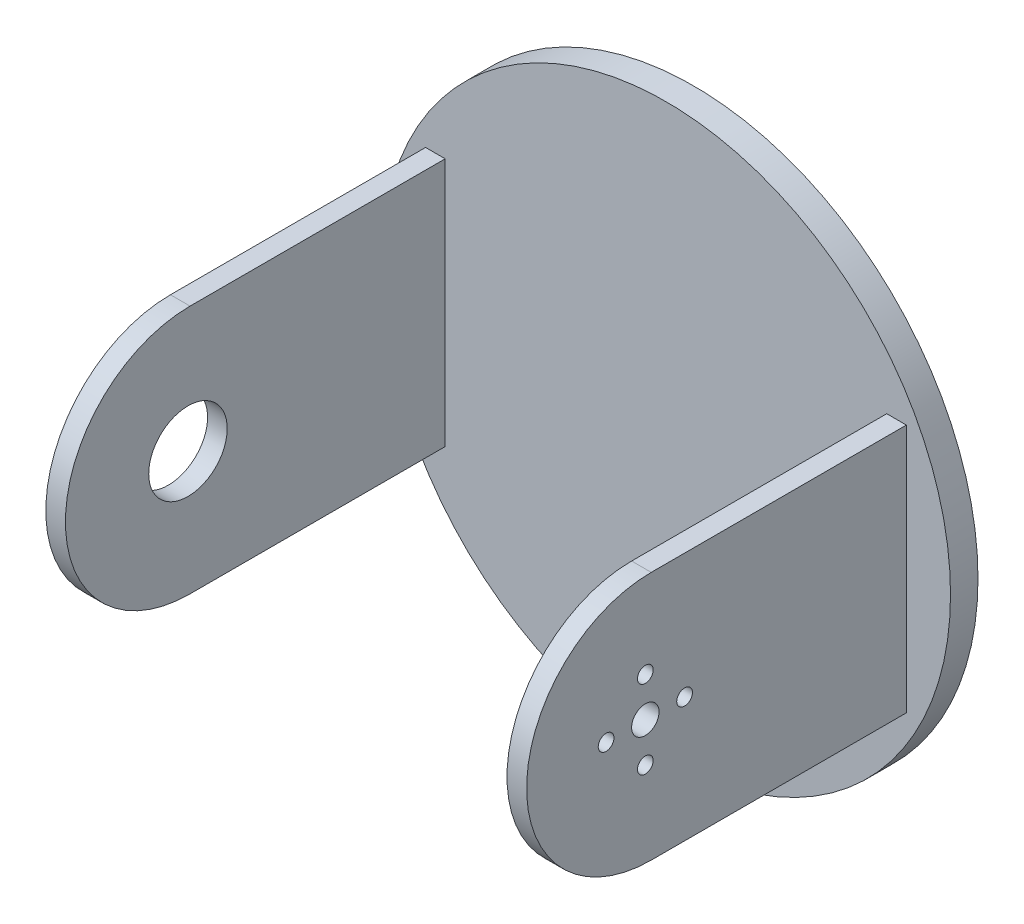
ISO-10303-21;
HEADER;
FILE_DESCRIPTION(('STEP AP214'),'2;1');
FILE_NAME('part.step','',(''),(''),'','','');
FILE_SCHEMA(('AUTOMOTIVE_DESIGN { 1 0 10303 214 1 1 1 1 }'));
ENDSEC;
DATA;
#1=APPLICATION_CONTEXT('core data for automotive mechanical design processes');
#2=APPLICATION_PROTOCOL_DEFINITION('international standard','automotive_design',2000,#1);
#3=PRODUCT_CONTEXT('',#1,'mechanical');
#4=PRODUCT('Part','Part','',(#3));
#5=PRODUCT_RELATED_PRODUCT_CATEGORY('part','',(#4));
#6=PRODUCT_DEFINITION_FORMATION('','',#4);
#7=PRODUCT_DEFINITION_CONTEXT('part definition',#1,'design');
#8=PRODUCT_DEFINITION('design','',#6,#7);
#9=PRODUCT_DEFINITION_SHAPE('','',#8);
#10=(LENGTH_UNIT() NAMED_UNIT(*) SI_UNIT(.MILLI.,.METRE.));
#11=(NAMED_UNIT(*) PLANE_ANGLE_UNIT() SI_UNIT($,.RADIAN.));
#12=(NAMED_UNIT(*) SI_UNIT($,.STERADIAN.) SOLID_ANGLE_UNIT());
#13=UNCERTAINTY_MEASURE_WITH_UNIT(LENGTH_MEASURE(1.E-05),#10,'distance_accuracy_value','');
#14=(GEOMETRIC_REPRESENTATION_CONTEXT(3) GLOBAL_UNCERTAINTY_ASSIGNED_CONTEXT((#13)) GLOBAL_UNIT_ASSIGNED_CONTEXT((#10,
#11,#12)) REPRESENTATION_CONTEXT('',''));
#15=CARTESIAN_POINT('',(0.,0.,0.));
#16=DIRECTION('',(0.,0.,1.));
#17=DIRECTION('',(1.,0.,0.));
#18=AXIS2_PLACEMENT_3D('',#15,#16,#17);
#19=CARTESIAN_POINT('',(0.,0.,0.));
#20=DIRECTION('',(0.,0.,1.));
#21=DIRECTION('',(1.,0.,0.));
#22=AXIS2_PLACEMENT_3D('',#19,#20,#21);
#23=PLANE('',#22);
#24=CARTESIAN_POINT('',(0.,0.,0.));
#25=DIRECTION('',(0.,0.,1.));
#26=DIRECTION('',(1.,0.,0.));
#27=AXIS2_PLACEMENT_3D('',#24,#25,#26);
#28=CIRCLE('',#27,72.5);
#29=CARTESIAN_POINT('',(72.5,0.,0.));
#30=VERTEX_POINT('',#29);
#31=EDGE_CURVE('E208',#30,#30,#28,.T.);
#32=ORIENTED_EDGE('',*,*,#31,.T.);
#33=EDGE_LOOP('',(#32));
#34=FACE_BOUND('',#33,.T.);
#35=DIRECTION('',(-1.,0.,0.));
#36=VECTOR('',#35,1.);
#37=CARTESIAN_POINT('',(-56.25,31.75,0.));
#38=LINE('',#37,#36);
#39=CARTESIAN_POINT('',(-56.25,31.75,0.));
#40=VERTEX_POINT('',#39);
#41=CARTESIAN_POINT('',(-61.25,31.75,0.));
#42=VERTEX_POINT('',#41);
#43=EDGE_CURVE('E143',#40,#42,#38,.T.);
#44=ORIENTED_EDGE('',*,*,#43,.F.);
#45=DIRECTION('',(0.,-1.,0.));
#46=VECTOR('',#45,1.);
#47=CARTESIAN_POINT('',(-56.25,31.75,0.));
#48=LINE('',#47,#46);
#49=CARTESIAN_POINT('',(-56.25,-31.75,0.));
#50=VERTEX_POINT('',#49);
#51=EDGE_CURVE('E139',#40,#50,#48,.T.);
#52=ORIENTED_EDGE('',*,*,#51,.T.);
#53=DIRECTION('',(1.,0.,0.));
#54=VECTOR('',#53,1.);
#55=CARTESIAN_POINT('',(-61.25,-31.75,0.));
#56=LINE('',#55,#54);
#57=CARTESIAN_POINT('',(-61.25,-31.75,0.));
#58=VERTEX_POINT('',#57);
#59=EDGE_CURVE('E150',#58,#50,#56,.T.);
#60=ORIENTED_EDGE('',*,*,#59,.F.);
#61=DIRECTION('',(0.,-1.,0.));
#62=VECTOR('',#61,1.);
#63=CARTESIAN_POINT('',(-61.25,31.75,0.));
#64=LINE('',#63,#62);
#65=EDGE_CURVE('E125',#42,#58,#64,.T.);
#66=ORIENTED_EDGE('',*,*,#65,.F.);
#67=EDGE_LOOP('',(#44,#52,#60,#66));
#68=FACE_BOUND('',#67,.T.);
#69=DIRECTION('',(-1.,0.,0.));
#70=VECTOR('',#69,1.);
#71=CARTESIAN_POINT('',(61.25,-31.75,0.));
#72=LINE('',#71,#70);
#73=CARTESIAN_POINT('',(61.25,-31.75,0.));
#74=VERTEX_POINT('',#73);
#75=CARTESIAN_POINT('',(56.25,-31.75,0.));
#76=VERTEX_POINT('',#75);
#77=EDGE_CURVE('E57',#74,#76,#72,.T.);
#78=ORIENTED_EDGE('',*,*,#77,.T.);
#79=DIRECTION('',(0.,-1.,0.));
#80=VECTOR('',#79,1.);
#81=CARTESIAN_POINT('',(56.25,31.75,0.));
#82=LINE('',#81,#80);
#83=CARTESIAN_POINT('',(56.25,31.75,0.));
#84=VERTEX_POINT('',#83);
#85=EDGE_CURVE('E204',#84,#76,#82,.T.);
#86=ORIENTED_EDGE('',*,*,#85,.F.);
#87=DIRECTION('',(1.,0.,0.));
#88=VECTOR('',#87,1.);
#89=CARTESIAN_POINT('',(56.25,31.75,0.));
#90=LINE('',#89,#88);
#91=CARTESIAN_POINT('',(61.25,31.75,0.));
#92=VERTEX_POINT('',#91);
#93=EDGE_CURVE('E196',#84,#92,#90,.T.);
#94=ORIENTED_EDGE('',*,*,#93,.T.);
#95=DIRECTION('',(0.,-1.,0.));
#96=VECTOR('',#95,1.);
#97=CARTESIAN_POINT('',(61.25,31.75,0.));
#98=LINE('',#97,#96);
#99=EDGE_CURVE('E62',#92,#74,#98,.T.);
#100=ORIENTED_EDGE('',*,*,#99,.T.);
#101=EDGE_LOOP('',(#78,#86,#94,#100));
#102=FACE_BOUND('',#101,.T.);
#103=ADVANCED_FACE('F39',(#34,#68,#102),#23,.T.);
#104=CARTESIAN_POINT('',(-56.25,31.75,65.));
#105=DIRECTION('',(0.,-1.,0.));
#106=DIRECTION('',(0.,0.,-1.));
#107=AXIS2_PLACEMENT_3D('',#104,#105,#106);
#108=PLANE('',#107);
#109=ORIENTED_EDGE('',*,*,#43,.T.);
#110=DIRECTION('',(0.,0.,-1.));
#111=VECTOR('',#110,1.);
#112=CARTESIAN_POINT('',(-61.25,31.75,65.));
#113=LINE('',#112,#111);
#114=CARTESIAN_POINT('',(-61.25,31.75,65.));
#115=VERTEX_POINT('',#114);
#116=EDGE_CURVE('E43',#115,#42,#113,.T.);
#117=ORIENTED_EDGE('',*,*,#116,.F.);
#118=DIRECTION('',(-1.,0.,0.));
#119=VECTOR('',#118,1.);
#120=CARTESIAN_POINT('',(-56.25,31.75,65.));
#121=LINE('',#120,#119);
#122=CARTESIAN_POINT('',(-56.25,31.75,65.));
#123=VERTEX_POINT('',#122);
#124=EDGE_CURVE('E113',#123,#115,#121,.T.);
#125=ORIENTED_EDGE('',*,*,#124,.F.);
#126=DIRECTION('',(0.,0.,-1.));
#127=VECTOR('',#126,1.);
#128=CARTESIAN_POINT('',(-56.25,31.75,65.));
#129=LINE('',#128,#127);
#130=EDGE_CURVE('E133',#123,#40,#129,.T.);
#131=ORIENTED_EDGE('',*,*,#130,.T.);
#132=EDGE_LOOP('',(#109,#117,#125,#131));
#133=FACE_BOUND('',#132,.T.);
#134=ADVANCED_FACE('F41',(#133),#108,.F.);
#135=CARTESIAN_POINT('',(-61.25,31.75,65.));
#136=DIRECTION('',(1.,0.,0.));
#137=DIRECTION('',(0.,0.,-1.));
#138=AXIS2_PLACEMENT_3D('',#135,#136,#137);
#139=PLANE('',#138);
#140=CARTESIAN_POINT('',(-61.25,0.,65.5309086036091));
#141=DIRECTION('',(-1.,0.,0.));
#142=DIRECTION('',(0.,0.,1.));
#143=AXIS2_PLACEMENT_3D('',#140,#141,#142);
#144=CIRCLE('',#143,10.);
#145=CARTESIAN_POINT('',(-61.25,0.,75.5309086036091));
#146=VERTEX_POINT('',#145);
#147=EDGE_CURVE('E314',#146,#146,#144,.T.);
#148=ORIENTED_EDGE('',*,*,#147,.F.);
#149=EDGE_LOOP('',(#148));
#150=FACE_BOUND('',#149,.T.);
#151=ORIENTED_EDGE('',*,*,#65,.T.);
#152=DIRECTION('',(0.,0.,-1.));
#153=VECTOR('',#152,1.);
#154=CARTESIAN_POINT('',(-61.25,-31.75,65.));
#155=LINE('',#154,#153);
#156=CARTESIAN_POINT('',(-61.25,-31.75,65.));
#157=VERTEX_POINT('',#156);
#158=EDGE_CURVE('E123',#157,#58,#155,.T.);
#159=ORIENTED_EDGE('',*,*,#158,.F.);
#160=CARTESIAN_POINT('',(-61.25,0.,65.));
#161=DIRECTION('',(1.,0.,0.));
#162=DIRECTION('',(0.,1.,0.));
#163=AXIS2_PLACEMENT_3D('',#160,#161,#162);
#164=CIRCLE('',#163,31.75);
#165=EDGE_CURVE('E106',#115,#157,#164,.T.);
#166=ORIENTED_EDGE('',*,*,#165,.F.);
#167=ORIENTED_EDGE('',*,*,#116,.T.);
#168=EDGE_LOOP('',(#151,#159,#166,#167));
#169=FACE_BOUND('',#168,.T.);
#170=ADVANCED_FACE('F124',(#150,#169),#139,.F.);
#171=CARTESIAN_POINT('',(-61.25,-31.75,65.));
#172=DIRECTION('',(0.,1.,0.));
#173=DIRECTION('',(0.,0.,1.));
#174=AXIS2_PLACEMENT_3D('',#171,#172,#173);
#175=PLANE('',#174);
#176=ORIENTED_EDGE('',*,*,#59,.T.);
#177=DIRECTION('',(0.,0.,-1.));
#178=VECTOR('',#177,1.);
#179=CARTESIAN_POINT('',(-56.25,-31.75,65.));
#180=LINE('',#179,#178);
#181=CARTESIAN_POINT('',(-56.25,-31.75,65.));
#182=VERTEX_POINT('',#181);
#183=EDGE_CURVE('E129',#182,#50,#180,.T.);
#184=ORIENTED_EDGE('',*,*,#183,.F.);
#185=DIRECTION('',(1.,0.,0.));
#186=VECTOR('',#185,1.);
#187=CARTESIAN_POINT('',(-61.25,-31.75,65.));
#188=LINE('',#187,#186);
#189=EDGE_CURVE('E110',#157,#182,#188,.T.);
#190=ORIENTED_EDGE('',*,*,#189,.F.);
#191=ORIENTED_EDGE('',*,*,#158,.T.);
#192=EDGE_LOOP('',(#176,#184,#190,#191));
#193=FACE_BOUND('',#192,.T.);
#194=ADVANCED_FACE('F130',(#193),#175,.F.);
#195=CARTESIAN_POINT('',(-56.25,31.75,65.));
#196=DIRECTION('',(1.,0.,0.));
#197=DIRECTION('',(0.,1.,0.));
#198=AXIS2_PLACEMENT_3D('',#195,#196,#197);
#199=PLANE('',#198);
#200=CARTESIAN_POINT('',(-56.25,0.,65.5309086036091));
#201=DIRECTION('',(1.,0.,0.));
#202=DIRECTION('',(0.,1.,0.));
#203=AXIS2_PLACEMENT_3D('',#200,#201,#202);
#204=CIRCLE('',#203,10.);
#205=CARTESIAN_POINT('',(-56.25,10.,65.5309086036091));
#206=VERTEX_POINT('',#205);
#207=EDGE_CURVE('E317',#206,#206,#204,.F.);
#208=ORIENTED_EDGE('',*,*,#207,.T.);
#209=EDGE_LOOP('',(#208));
#210=FACE_BOUND('',#209,.T.);
#211=ORIENTED_EDGE('',*,*,#51,.F.);
#212=ORIENTED_EDGE('',*,*,#130,.F.);
#213=CARTESIAN_POINT('',(-56.25,0.,65.));
#214=DIRECTION('',(1.,0.,0.));
#215=DIRECTION('',(0.,1.,0.));
#216=AXIS2_PLACEMENT_3D('',#213,#214,#215);
#217=CIRCLE('',#216,31.75);
#218=EDGE_CURVE('E119',#123,#182,#217,.T.);
#219=ORIENTED_EDGE('',*,*,#218,.T.);
#220=ORIENTED_EDGE('',*,*,#183,.T.);
#221=EDGE_LOOP('',(#211,#212,#219,#220));
#222=FACE_BOUND('',#221,.T.);
#223=ADVANCED_FACE('F158',(#210,#222),#199,.T.);
#224=CARTESIAN_POINT('',(0.,0.,-7.));
#225=DIRECTION('',(0.,0.,1.));
#226=DIRECTION('',(1.,0.,0.));
#227=AXIS2_PLACEMENT_3D('',#224,#225,#226);
#228=CYLINDRICAL_SURFACE('',#227,72.5);
#229=CARTESIAN_POINT('',(0.,0.,-7.));
#230=DIRECTION('',(0.,0.,1.));
#231=DIRECTION('',(1.,0.,0.));
#232=AXIS2_PLACEMENT_3D('',#229,#230,#231);
#233=CIRCLE('',#232,72.5);
#234=CARTESIAN_POINT('',(72.5,0.,-7.));
#235=VERTEX_POINT('',#234);
#236=EDGE_CURVE('E147',#235,#235,#233,.T.);
#237=ORIENTED_EDGE('',*,*,#236,.T.);
#238=EDGE_LOOP('',(#237));
#239=FACE_BOUND('',#238,.T.);
#240=ORIENTED_EDGE('',*,*,#31,.F.);
#241=EDGE_LOOP('',(#240));
#242=FACE_BOUND('',#241,.T.);
#243=ADVANCED_FACE('F221',(#239,#242),#228,.T.);
#244=CARTESIAN_POINT('',(0.,0.,-7.));
#245=DIRECTION('',(0.,0.,1.));
#246=DIRECTION('',(1.,0.,0.));
#247=AXIS2_PLACEMENT_3D('',#244,#245,#246);
#248=PLANE('',#247);
#249=CARTESIAN_POINT('',(0.,0.,-7.));
#250=DIRECTION('',(0.,0.,-1.));
#251=DIRECTION('',(-1.,0.,0.));
#252=AXIS2_PLACEMENT_3D('',#249,#250,#251);
#253=CIRCLE('',#252,30.);
#254=CARTESIAN_POINT('',(-30.,0.,-7.));
#255=VERTEX_POINT('',#254);
#256=EDGE_CURVE('E49',#255,#255,#253,.T.);
#257=ORIENTED_EDGE('',*,*,#256,.F.);
#258=EDGE_LOOP('',(#257));
#259=FACE_BOUND('',#258,.T.);
#260=ORIENTED_EDGE('',*,*,#236,.F.);
#261=EDGE_LOOP('',(#260));
#262=FACE_BOUND('',#261,.T.);
#263=ADVANCED_FACE('F223',(#259,#262),#248,.F.);
#264=CARTESIAN_POINT('',(56.25,31.75,65.));
#265=DIRECTION('',(1.,0.,0.));
#266=DIRECTION('',(0.,0.,-1.));
#267=AXIS2_PLACEMENT_3D('',#264,#265,#266);
#268=PLANE('',#267);
#269=CARTESIAN_POINT('',(56.25,10.,66.5059939664445));
#270=DIRECTION('',(1.,0.,0.));
#271=DIRECTION('',(0.,0.,-1.));
#272=AXIS2_PLACEMENT_3D('',#269,#270,#271);
#273=CIRCLE('',#272,2.);
#274=CARTESIAN_POINT('',(56.25,10.,64.5059939664445));
#275=VERTEX_POINT('',#274);
#276=EDGE_CURVE('E332',#275,#275,#273,.F.);
#277=ORIENTED_EDGE('',*,*,#276,.F.);
#278=EDGE_LOOP('',(#277));
#279=FACE_BOUND('',#278,.T.);
#280=CARTESIAN_POINT('',(56.25,0.,76.5059939664445));
#281=DIRECTION('',(1.,0.,0.));
#282=DIRECTION('',(0.,0.,-1.));
#283=AXIS2_PLACEMENT_3D('',#280,#281,#282);
#284=CIRCLE('',#283,2.00000000000001);
#285=CARTESIAN_POINT('',(56.25,0.,74.5059939664445));
#286=VERTEX_POINT('',#285);
#287=EDGE_CURVE('E319',#286,#286,#284,.F.);
#288=ORIENTED_EDGE('',*,*,#287,.F.);
#289=EDGE_LOOP('',(#288));
#290=FACE_BOUND('',#289,.T.);
#291=CARTESIAN_POINT('',(56.25,-10.,66.5059939664445));
#292=DIRECTION('',(1.,0.,0.));
#293=DIRECTION('',(0.,0.,-1.));
#294=AXIS2_PLACEMENT_3D('',#291,#292,#293);
#295=CIRCLE('',#294,2.);
#296=CARTESIAN_POINT('',(56.25,-10.,64.5059939664445));
#297=VERTEX_POINT('',#296);
#298=EDGE_CURVE('E338',#297,#297,#295,.F.);
#299=ORIENTED_EDGE('',*,*,#298,.F.);
#300=EDGE_LOOP('',(#299));
#301=FACE_BOUND('',#300,.T.);
#302=CARTESIAN_POINT('',(56.25,0.,66.5059939664445));
#303=DIRECTION('',(1.,0.,0.));
#304=DIRECTION('',(0.,0.,-1.));
#305=AXIS2_PLACEMENT_3D('',#302,#303,#304);
#306=CIRCLE('',#305,3.49999999999999);
#307=CARTESIAN_POINT('',(56.25,0.,63.0059939664445));
#308=VERTEX_POINT('',#307);
#309=EDGE_CURVE('E345',#308,#308,#306,.F.);
#310=ORIENTED_EDGE('',*,*,#309,.F.);
#311=EDGE_LOOP('',(#310));
#312=FACE_BOUND('',#311,.T.);
#313=CARTESIAN_POINT('',(56.25,0.,56.5059939664445));
#314=DIRECTION('',(1.,0.,0.));
#315=DIRECTION('',(0.,0.,-1.));
#316=AXIS2_PLACEMENT_3D('',#313,#314,#315);
#317=CIRCLE('',#316,2.);
#318=CARTESIAN_POINT('',(56.25,0.,54.5059939664445));
#319=VERTEX_POINT('',#318);
#320=EDGE_CURVE('E350',#319,#319,#317,.F.);
#321=ORIENTED_EDGE('',*,*,#320,.F.);
#322=EDGE_LOOP('',(#321));
#323=FACE_BOUND('',#322,.T.);
#324=ORIENTED_EDGE('',*,*,#85,.T.);
#325=DIRECTION('',(0.,0.,-1.));
#326=VECTOR('',#325,1.);
#327=CARTESIAN_POINT('',(56.25,-31.75,65.));
#328=LINE('',#327,#326);
#329=CARTESIAN_POINT('',(56.25,-31.75,65.));
#330=VERTEX_POINT('',#329);
#331=EDGE_CURVE('E178',#330,#76,#328,.T.);
#332=ORIENTED_EDGE('',*,*,#331,.F.);
#333=CARTESIAN_POINT('',(56.25,0.,65.));
#334=DIRECTION('',(-1.,0.,0.));
#335=DIRECTION('',(0.,0.,1.));
#336=AXIS2_PLACEMENT_3D('',#333,#334,#335);
#337=CIRCLE('',#336,31.75);
#338=CARTESIAN_POINT('',(56.25,31.75,65.));
#339=VERTEX_POINT('',#338);
#340=EDGE_CURVE('E118',#330,#339,#337,.T.);
#341=ORIENTED_EDGE('',*,*,#340,.T.);
#342=DIRECTION('',(0.,0.,-1.));
#343=VECTOR('',#342,1.);
#344=CARTESIAN_POINT('',(56.25,31.75,65.));
#345=LINE('',#344,#343);
#346=EDGE_CURVE('E191',#339,#84,#345,.T.);
#347=ORIENTED_EDGE('',*,*,#346,.T.);
#348=EDGE_LOOP('',(#324,#332,#341,#347));
#349=FACE_BOUND('',#348,.T.);
#350=ADVANCED_FACE('F230',(#279,#290,#301,#312,#323,#349),#268,.F.);
#351=CARTESIAN_POINT('',(61.25,-31.75,65.));
#352=DIRECTION('',(0.,-1.,0.));
#353=DIRECTION('',(0.,0.,-1.));
#354=AXIS2_PLACEMENT_3D('',#351,#352,#353);
#355=PLANE('',#354);
#356=ORIENTED_EDGE('',*,*,#77,.F.);
#357=DIRECTION('',(0.,0.,-1.));
#358=VECTOR('',#357,1.);
#359=CARTESIAN_POINT('',(61.25,-31.75,65.));
#360=LINE('',#359,#358);
#361=CARTESIAN_POINT('',(61.25,-31.75,65.));
#362=VERTEX_POINT('',#361);
#363=EDGE_CURVE('E184',#362,#74,#360,.T.);
#364=ORIENTED_EDGE('',*,*,#363,.F.);
#365=DIRECTION('',(-1.,0.,0.));
#366=VECTOR('',#365,1.);
#367=CARTESIAN_POINT('',(61.25,-31.75,65.));
#368=LINE('',#367,#366);
#369=EDGE_CURVE('E199',#362,#330,#368,.T.);
#370=ORIENTED_EDGE('',*,*,#369,.T.);
#371=ORIENTED_EDGE('',*,*,#331,.T.);
#372=EDGE_LOOP('',(#356,#364,#370,#371));
#373=FACE_BOUND('',#372,.T.);
#374=ADVANCED_FACE('F249',(#373),#355,.T.);
#375=CARTESIAN_POINT('',(61.25,31.75,65.));
#376=DIRECTION('',(1.,0.,0.));
#377=DIRECTION('',(0.,0.,-1.));
#378=AXIS2_PLACEMENT_3D('',#375,#376,#377);
#379=PLANE('',#378);
#380=CARTESIAN_POINT('',(61.25,10.,66.5059939664445));
#381=DIRECTION('',(1.,0.,0.));
#382=DIRECTION('',(0.,0.,-1.));
#383=AXIS2_PLACEMENT_3D('',#380,#381,#382);
#384=CIRCLE('',#383,2.);
#385=CARTESIAN_POINT('',(61.25,10.,64.5059939664445));
#386=VERTEX_POINT('',#385);
#387=EDGE_CURVE('E328',#386,#386,#384,.T.);
#388=ORIENTED_EDGE('',*,*,#387,.F.);
#389=EDGE_LOOP('',(#388));
#390=FACE_BOUND('',#389,.T.);
#391=CARTESIAN_POINT('',(61.25,0.,76.5059939664445));
#392=DIRECTION('',(1.,0.,0.));
#393=DIRECTION('',(0.,0.,-1.));
#394=AXIS2_PLACEMENT_3D('',#391,#392,#393);
#395=CIRCLE('',#394,2.00000000000001);
#396=CARTESIAN_POINT('',(61.25,0.,74.5059939664445));
#397=VERTEX_POINT('',#396);
#398=EDGE_CURVE('E324',#397,#397,#395,.T.);
#399=ORIENTED_EDGE('',*,*,#398,.F.);
#400=EDGE_LOOP('',(#399));
#401=FACE_BOUND('',#400,.T.);
#402=CARTESIAN_POINT('',(61.25,-10.,66.5059939664445));
#403=DIRECTION('',(1.,0.,0.));
#404=DIRECTION('',(0.,0.,-1.));
#405=AXIS2_PLACEMENT_3D('',#402,#403,#404);
#406=CIRCLE('',#405,2.);
#407=CARTESIAN_POINT('',(61.25,-10.,64.5059939664445));
#408=VERTEX_POINT('',#407);
#409=EDGE_CURVE('E342',#408,#408,#406,.T.);
#410=ORIENTED_EDGE('',*,*,#409,.F.);
#411=EDGE_LOOP('',(#410));
#412=FACE_BOUND('',#411,.T.);
#413=CARTESIAN_POINT('',(61.25,0.,66.5059939664445));
#414=DIRECTION('',(1.,0.,0.));
#415=DIRECTION('',(0.,0.,-1.));
#416=AXIS2_PLACEMENT_3D('',#413,#414,#415);
#417=CIRCLE('',#416,3.49999999999999);
#418=CARTESIAN_POINT('',(61.25,0.,63.0059939664445));
#419=VERTEX_POINT('',#418);
#420=EDGE_CURVE('E354',#419,#419,#417,.T.);
#421=ORIENTED_EDGE('',*,*,#420,.F.);
#422=EDGE_LOOP('',(#421));
#423=FACE_BOUND('',#422,.T.);
#424=CARTESIAN_POINT('',(61.25,0.,56.5059939664445));
#425=DIRECTION('',(1.,0.,0.));
#426=DIRECTION('',(0.,0.,-1.));
#427=AXIS2_PLACEMENT_3D('',#424,#425,#426);
#428=CIRCLE('',#427,2.);
#429=CARTESIAN_POINT('',(61.25,0.,54.5059939664445));
#430=VERTEX_POINT('',#429);
#431=EDGE_CURVE('E333',#430,#430,#428,.T.);
#432=ORIENTED_EDGE('',*,*,#431,.F.);
#433=EDGE_LOOP('',(#432));
#434=FACE_BOUND('',#433,.T.);
#435=ORIENTED_EDGE('',*,*,#99,.F.);
#436=DIRECTION('',(0.,0.,-1.));
#437=VECTOR('',#436,1.);
#438=CARTESIAN_POINT('',(61.25,31.75,65.));
#439=LINE('',#438,#437);
#440=CARTESIAN_POINT('',(61.25,31.75,65.));
#441=VERTEX_POINT('',#440);
#442=EDGE_CURVE('E187',#441,#92,#439,.T.);
#443=ORIENTED_EDGE('',*,*,#442,.F.);
#444=CARTESIAN_POINT('',(61.25,0.,65.));
#445=DIRECTION('',(-1.,0.,0.));
#446=DIRECTION('',(0.,0.,1.));
#447=AXIS2_PLACEMENT_3D('',#444,#445,#446);
#448=CIRCLE('',#447,31.75);
#449=EDGE_CURVE('E174',#362,#441,#448,.T.);
#450=ORIENTED_EDGE('',*,*,#449,.F.);
#451=ORIENTED_EDGE('',*,*,#363,.T.);
#452=EDGE_LOOP('',(#435,#443,#450,#451));
#453=FACE_BOUND('',#452,.T.);
#454=ADVANCED_FACE('F245',(#390,#401,#412,#423,#434,#453),#379,.T.);
#455=CARTESIAN_POINT('',(56.25,31.75,65.));
#456=DIRECTION('',(0.,1.,0.));
#457=DIRECTION('',(0.,0.,1.));
#458=AXIS2_PLACEMENT_3D('',#455,#456,#457);
#459=PLANE('',#458);
#460=ORIENTED_EDGE('',*,*,#93,.F.);
#461=ORIENTED_EDGE('',*,*,#346,.F.);
#462=DIRECTION('',(1.,0.,0.));
#463=VECTOR('',#462,1.);
#464=CARTESIAN_POINT('',(56.25,31.75,65.));
#465=LINE('',#464,#463);
#466=EDGE_CURVE('E195',#339,#441,#465,.T.);
#467=ORIENTED_EDGE('',*,*,#466,.T.);
#468=ORIENTED_EDGE('',*,*,#442,.T.);
#469=EDGE_LOOP('',(#460,#461,#467,#468));
#470=FACE_BOUND('',#469,.T.);
#471=ADVANCED_FACE('F241',(#470),#459,.T.);
#472=CARTESIAN_POINT('',(61.25,0.,65.));
#473=DIRECTION('',(-1.,0.,0.));
#474=DIRECTION('',(0.,0.,1.));
#475=AXIS2_PLACEMENT_3D('',#472,#473,#474);
#476=CYLINDRICAL_SURFACE('',#475,31.75);
#477=ORIENTED_EDGE('',*,*,#340,.F.);
#478=ORIENTED_EDGE('',*,*,#369,.F.);
#479=ORIENTED_EDGE('',*,*,#449,.T.);
#480=ORIENTED_EDGE('',*,*,#466,.F.);
#481=EDGE_LOOP('',(#477,#478,#479,#480));
#482=FACE_BOUND('',#481,.T.);
#483=ADVANCED_FACE('F244',(#482),#476,.T.);
#484=CARTESIAN_POINT('',(-61.25,0.,65.));
#485=DIRECTION('',(1.,0.,0.));
#486=DIRECTION('',(0.,1.,0.));
#487=AXIS2_PLACEMENT_3D('',#484,#485,#486);
#488=CYLINDRICAL_SURFACE('',#487,31.75);
#489=ORIENTED_EDGE('',*,*,#218,.F.);
#490=ORIENTED_EDGE('',*,*,#124,.T.);
#491=ORIENTED_EDGE('',*,*,#165,.T.);
#492=ORIENTED_EDGE('',*,*,#189,.T.);
#493=EDGE_LOOP('',(#489,#490,#491,#492));
#494=FACE_BOUND('',#493,.T.);
#495=ADVANCED_FACE('F108',(#494),#488,.T.);
#496=CARTESIAN_POINT('',(0.,0.,-14.));
#497=DIRECTION('',(0.,0.,1.));
#498=DIRECTION('',(1.,0.,0.));
#499=AXIS2_PLACEMENT_3D('',#496,#497,#498);
#500=CYLINDRICAL_SURFACE('',#499,30.);
#501=CARTESIAN_POINT('',(0.,0.,-14.));
#502=DIRECTION('',(0.,0.,-1.));
#503=DIRECTION('',(-1.,0.,0.));
#504=AXIS2_PLACEMENT_3D('',#501,#502,#503);
#505=CIRCLE('',#504,30.);
#506=CARTESIAN_POINT('',(-30.,0.,-14.));
#507=VERTEX_POINT('',#506);
#508=EDGE_CURVE('E169',#507,#507,#505,.T.);
#509=ORIENTED_EDGE('',*,*,#508,.F.);
#510=EDGE_LOOP('',(#509));
#511=FACE_BOUND('',#510,.T.);
#512=ORIENTED_EDGE('',*,*,#256,.T.);
#513=EDGE_LOOP('',(#512));
#514=FACE_BOUND('',#513,.T.);
#515=ADVANCED_FACE('F262',(#511,#514),#500,.T.);
#516=CARTESIAN_POINT('',(0.,0.,-16.));
#517=DIRECTION('',(0.,0.,1.));
#518=DIRECTION('',(1.,0.,0.));
#519=AXIS2_PLACEMENT_3D('',#516,#517,#518);
#520=CYLINDRICAL_SURFACE('',#519,32.);
#521=CARTESIAN_POINT('',(0.,0.,-16.));
#522=DIRECTION('',(0.,0.,-1.));
#523=DIRECTION('',(-1.,0.,0.));
#524=AXIS2_PLACEMENT_3D('',#521,#522,#523);
#525=CIRCLE('',#524,32.);
#526=CARTESIAN_POINT('',(-32.,0.,-16.));
#527=VERTEX_POINT('',#526);
#528=EDGE_CURVE('E368',#527,#527,#525,.T.);
#529=ORIENTED_EDGE('',*,*,#528,.F.);
#530=EDGE_LOOP('',(#529));
#531=FACE_BOUND('',#530,.T.);
#532=CARTESIAN_POINT('',(0.,0.,-14.));
#533=DIRECTION('',(0.,0.,-1.));
#534=DIRECTION('',(-1.,0.,0.));
#535=AXIS2_PLACEMENT_3D('',#532,#533,#534);
#536=CIRCLE('',#535,32.);
#537=CARTESIAN_POINT('',(-32.,0.,-14.));
#538=VERTEX_POINT('',#537);
#539=EDGE_CURVE('E366',#538,#538,#536,.T.);
#540=ORIENTED_EDGE('',*,*,#539,.T.);
#541=EDGE_LOOP('',(#540));
#542=FACE_BOUND('',#541,.T.);
#543=ADVANCED_FACE('F265',(#531,#542),#520,.T.);
#544=CARTESIAN_POINT('',(0.,0.,-16.));
#545=DIRECTION('',(0.,0.,-1.));
#546=DIRECTION('',(-1.,0.,0.));
#547=AXIS2_PLACEMENT_3D('',#544,#545,#546);
#548=PLANE('',#547);
#549=CARTESIAN_POINT('',(0.,0.,-16.));
#550=DIRECTION('',(0.,0.,-1.));
#551=DIRECTION('',(-1.,0.,0.));
#552=AXIS2_PLACEMENT_3D('',#549,#550,#551);
#553=CIRCLE('',#552,10.);
#554=CARTESIAN_POINT('',(-10.,0.,-16.));
#555=VERTEX_POINT('',#554);
#556=EDGE_CURVE('E11',#555,#555,#553,.T.);
#557=ORIENTED_EDGE('',*,*,#556,.F.);
#558=EDGE_LOOP('',(#557));
#559=FACE_BOUND('',#558,.T.);
#560=ORIENTED_EDGE('',*,*,#528,.T.);
#561=EDGE_LOOP('',(#560));
#562=FACE_BOUND('',#561,.T.);
#563=ADVANCED_FACE('F269',(#559,#562),#548,.T.);
#564=CARTESIAN_POINT('',(0.,0.,-14.));
#565=DIRECTION('',(0.,0.,-1.));
#566=DIRECTION('',(-1.,0.,0.));
#567=AXIS2_PLACEMENT_3D('',#564,#565,#566);
#568=PLANE('',#567);
#569=ORIENTED_EDGE('',*,*,#508,.T.);
#570=EDGE_LOOP('',(#569));
#571=FACE_BOUND('',#570,.T.);
#572=ORIENTED_EDGE('',*,*,#539,.F.);
#573=EDGE_LOOP('',(#572));
#574=FACE_BOUND('',#573,.T.);
#575=ADVANCED_FACE('F271',(#571,#574),#568,.F.);
#576=CARTESIAN_POINT('',(0.,0.,-33.));
#577=DIRECTION('',(0.,0.,1.));
#578=DIRECTION('',(1.,0.,0.));
#579=AXIS2_PLACEMENT_3D('',#576,#577,#578);
#580=CYLINDRICAL_SURFACE('',#579,10.);
#581=CARTESIAN_POINT('',(0.,0.,-33.));
#582=DIRECTION('',(0.,0.,-1.));
#583=DIRECTION('',(-1.,0.,0.));
#584=AXIS2_PLACEMENT_3D('',#581,#582,#583);
#585=CIRCLE('',#584,10.);
#586=CARTESIAN_POINT('',(-10.,0.,-33.));
#587=VERTEX_POINT('',#586);
#588=EDGE_CURVE('E337',#587,#587,#585,.T.);
#589=ORIENTED_EDGE('',*,*,#588,.F.);
#590=EDGE_LOOP('',(#589));
#591=FACE_BOUND('',#590,.T.);
#592=ORIENTED_EDGE('',*,*,#556,.T.);
#593=EDGE_LOOP('',(#592));
#594=FACE_BOUND('',#593,.T.);
#595=ADVANCED_FACE('F274',(#591,#594),#580,.T.);
#596=CARTESIAN_POINT('',(0.,0.,-33.));
#597=DIRECTION('',(0.,0.,-1.));
#598=DIRECTION('',(-1.,0.,0.));
#599=AXIS2_PLACEMENT_3D('',#596,#597,#598);
#600=PLANE('',#599);
#601=ORIENTED_EDGE('',*,*,#588,.T.);
#602=EDGE_LOOP('',(#601));
#603=FACE_BOUND('',#602,.T.);
#604=ADVANCED_FACE('F281',(#603),#600,.T.);
#605=CARTESIAN_POINT('',(46.3505050633884,0.,56.5059939664445));
#606=DIRECTION('',(1.,0.,0.));
#607=DIRECTION('',(0.,0.,-1.));
#608=AXIS2_PLACEMENT_3D('',#605,#606,#607);
#609=CYLINDRICAL_SURFACE('',#608,2.);
#610=ORIENTED_EDGE('',*,*,#320,.T.);
#611=EDGE_LOOP('',(#610));
#612=FACE_BOUND('',#611,.T.);
#613=ORIENTED_EDGE('',*,*,#431,.T.);
#614=EDGE_LOOP('',(#613));
#615=FACE_BOUND('',#614,.T.);
#616=ADVANCED_FACE('F285',(#612,#615),#609,.F.);
#617=CARTESIAN_POINT('',(46.3505050633884,0.,66.5059939664445));
#618=DIRECTION('',(1.,0.,0.));
#619=DIRECTION('',(0.,0.,-1.));
#620=AXIS2_PLACEMENT_3D('',#617,#618,#619);
#621=CYLINDRICAL_SURFACE('',#620,3.49999999999999);
#622=ORIENTED_EDGE('',*,*,#309,.T.);
#623=EDGE_LOOP('',(#622));
#624=FACE_BOUND('',#623,.T.);
#625=ORIENTED_EDGE('',*,*,#420,.T.);
#626=EDGE_LOOP('',(#625));
#627=FACE_BOUND('',#626,.T.);
#628=ADVANCED_FACE('F287',(#624,#627),#621,.F.);
#629=CARTESIAN_POINT('',(46.3505050633884,-10.,66.5059939664445));
#630=DIRECTION('',(1.,0.,0.));
#631=DIRECTION('',(0.,0.,-1.));
#632=AXIS2_PLACEMENT_3D('',#629,#630,#631);
#633=CYLINDRICAL_SURFACE('',#632,2.);
#634=ORIENTED_EDGE('',*,*,#298,.T.);
#635=EDGE_LOOP('',(#634));
#636=FACE_BOUND('',#635,.T.);
#637=ORIENTED_EDGE('',*,*,#409,.T.);
#638=EDGE_LOOP('',(#637));
#639=FACE_BOUND('',#638,.T.);
#640=ADVANCED_FACE('F290',(#636,#639),#633,.F.);
#641=CARTESIAN_POINT('',(46.3505050633884,0.,76.5059939664445));
#642=DIRECTION('',(1.,0.,0.));
#643=DIRECTION('',(0.,0.,-1.));
#644=AXIS2_PLACEMENT_3D('',#641,#642,#643);
#645=CYLINDRICAL_SURFACE('',#644,2.00000000000001);
#646=ORIENTED_EDGE('',*,*,#287,.T.);
#647=EDGE_LOOP('',(#646));
#648=FACE_BOUND('',#647,.T.);
#649=ORIENTED_EDGE('',*,*,#398,.T.);
#650=EDGE_LOOP('',(#649));
#651=FACE_BOUND('',#650,.T.);
#652=ADVANCED_FACE('F295',(#648,#651),#645,.F.);
#653=CARTESIAN_POINT('',(46.3505050633884,10.,66.5059939664445));
#654=DIRECTION('',(1.,0.,0.));
#655=DIRECTION('',(0.,0.,-1.));
#656=AXIS2_PLACEMENT_3D('',#653,#654,#655);
#657=CYLINDRICAL_SURFACE('',#656,2.);
#658=ORIENTED_EDGE('',*,*,#276,.T.);
#659=EDGE_LOOP('',(#658));
#660=FACE_BOUND('',#659,.T.);
#661=ORIENTED_EDGE('',*,*,#387,.T.);
#662=EDGE_LOOP('',(#661));
#663=FACE_BOUND('',#662,.T.);
#664=ADVANCED_FACE('F298',(#660,#663),#657,.F.);
#665=CARTESIAN_POINT('',(-27.9657287525381,0.,65.5309086036091));
#666=DIRECTION('',(-1.,0.,0.));
#667=DIRECTION('',(0.,0.,1.));
#668=AXIS2_PLACEMENT_3D('',#665,#666,#667);
#669=CYLINDRICAL_SURFACE('',#668,10.);
#670=ORIENTED_EDGE('',*,*,#147,.T.);
#671=EDGE_LOOP('',(#670));
#672=FACE_BOUND('',#671,.T.);
#673=ORIENTED_EDGE('',*,*,#207,.F.);
#674=EDGE_LOOP('',(#673));
#675=FACE_BOUND('',#674,.T.);
#676=ADVANCED_FACE('F305',(#672,#675),#669,.F.);
#677=CLOSED_SHELL('',(#103,#134,#170,#194,#223,#243,#263,#350,#374,#454,#471,#483,#495,#515,
#543,#563,#575,#595,#604,#616,#628,#640,#652,#664,#676));
#678=MANIFOLD_SOLID_BREP('B2',#677);
#679=ADVANCED_BREP_SHAPE_REPRESENTATION('',(#18,#678),#14);
#680=SHAPE_DEFINITION_REPRESENTATION(#9,#679);
ENDSEC;
END-ISO-10303-21;
